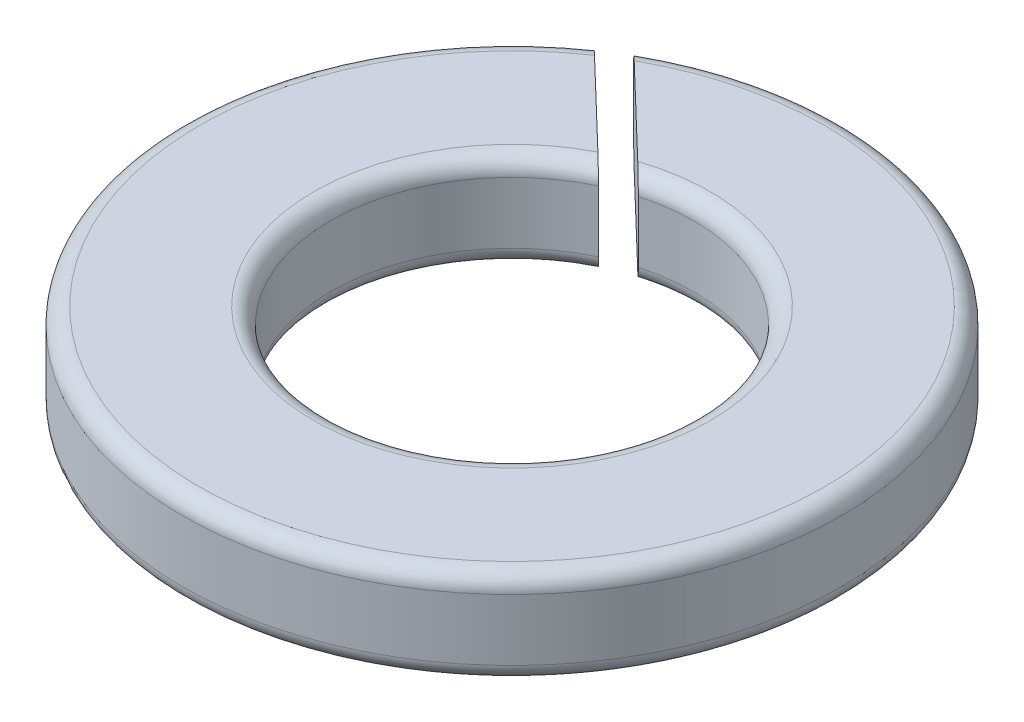
ISO-10303-21;
HEADER;
FILE_DESCRIPTION(('STEP AP214'),'2;1');
FILE_NAME('part.step','',(''),(''),'','','');
FILE_SCHEMA(('AUTOMOTIVE_DESIGN { 1 0 10303 214 1 1 1 1 }'));
ENDSEC;
DATA;
#1=APPLICATION_CONTEXT('core data for automotive mechanical design processes');
#2=APPLICATION_PROTOCOL_DEFINITION('international standard','automotive_design',2000,#1);
#3=PRODUCT_CONTEXT('',#1,'mechanical');
#4=PRODUCT('Part','Part','',(#3));
#5=PRODUCT_RELATED_PRODUCT_CATEGORY('part','',(#4));
#6=PRODUCT_DEFINITION_FORMATION('','',#4);
#7=PRODUCT_DEFINITION_CONTEXT('part definition',#1,'design');
#8=PRODUCT_DEFINITION('design','',#6,#7);
#9=PRODUCT_DEFINITION_SHAPE('','',#8);
#10=(LENGTH_UNIT() NAMED_UNIT(*) SI_UNIT(.MILLI.,.METRE.));
#11=(NAMED_UNIT(*) PLANE_ANGLE_UNIT() SI_UNIT($,.RADIAN.));
#12=(NAMED_UNIT(*) SI_UNIT($,.STERADIAN.) SOLID_ANGLE_UNIT());
#13=UNCERTAINTY_MEASURE_WITH_UNIT(LENGTH_MEASURE(1.E-05),#10,'distance_accuracy_value','');
#14=(GEOMETRIC_REPRESENTATION_CONTEXT(3) GLOBAL_UNCERTAINTY_ASSIGNED_CONTEXT((#13)) GLOBAL_UNIT_ASSIGNED_CONTEXT((#10,
#11,#12)) REPRESENTATION_CONTEXT('',''));
#15=CARTESIAN_POINT('',(0.,0.,0.));
#16=DIRECTION('',(0.,0.,1.));
#17=DIRECTION('',(1.,0.,0.));
#18=AXIS2_PLACEMENT_3D('',#15,#16,#17);
#19=CARTESIAN_POINT('',(-0.661624244853836,0.,-2.23760962036316));
#20=DIRECTION('',(-0.692531828189713,0.,0.721387321030952));
#21=DIRECTION('',(0.,1.,0.));
#22=AXIS2_PLACEMENT_3D('',#19,#20,#21);
#23=PLANE('',#22);
#24=CARTESIAN_POINT('',(-1.39063064984162,0.3,-2.93745576915144));
#25=CARTESIAN_POINT('',(-1.39063064984162,0.240064565782767,-2.93745576915144));
#26=CARTESIAN_POINT('',(-1.40954544991631,0.182080681289541,-2.95561397722314));
#27=CARTESIAN_POINT('',(-1.42744367148134,0.127213148576394,-2.97279626992557));
#28=CARTESIAN_POINT('',(-1.46075111564965,0.0847576622537913,-3.00477141632714));
#29=CARTESIAN_POINT('',(-1.49200131119978,0.0449244573085869,-3.03477160405527));
#30=CARTESIAN_POINT('',(-1.53500136012196,0.0219914936761899,-3.07605165102056));
#31=CARTESIAN_POINT('',(-1.57623612241025,0.,-3.11563702281732));
#32=CARTESIAN_POINT('',(-1.62078935238679,0.,-3.1584081235948));
#33=B_SPLINE_CURVE_WITH_KNOTS('',2,(#24,#25,#26,#27,#28,#29,#30,#31,#32),.UNSPECIFIED.,.F.,.F.,
(3,2,2,2,3),(0.,0.25,0.5,0.75,1.),.UNSPECIFIED.);
#34=CARTESIAN_POINT('',(-1.39063064984162,0.3,-2.93745576915144));
#35=VERTEX_POINT('',#34);
#36=CARTESIAN_POINT('',(-1.62078935238679,0.,-3.1584081235948));
#37=VERTEX_POINT('',#36);
#38=EDGE_CURVE('E280',#35,#37,#33,.T.);
#39=ORIENTED_EDGE('',*,*,#38,.T.);
#40=DIRECTION('',(0.721387321030952,0.,0.692531828189713));
#41=VECTOR('',#40,1.);
#42=CARTESIAN_POINT('',(-0.661624244853836,0.,-2.23760962036316));
#43=LINE('',#42,#41);
#44=CARTESIAN_POINT('',(-3.1522030132907,0.,-4.62856523806255));
#45=VERTEX_POINT('',#44);
#46=EDGE_CURVE('E109',#45,#37,#43,.T.);
#47=ORIENTED_EDGE('',*,*,#46,.F.);
#48=CARTESIAN_POINT('',(-3.1522030132907,0.,-4.62856523806255));
#49=CARTESIAN_POINT('',(-3.19474502488374,0.,-4.66940556919187));
#50=CARTESIAN_POINT('',(-3.23575724624348,0.0224543842464558,-4.70877730169722));
#51=CARTESIAN_POINT('',(-3.2757982018387,0.0443769959149166,-4.74721661906863));
#52=CARTESIAN_POINT('',(-3.30756432416192,0.0866392884122419,-4.77771209649892));
#53=CARTESIAN_POINT('',(-3.33815732282433,0.127340833431982,-4.80708137521483));
#54=CARTESIAN_POINT('',(-3.35588717423857,0.184143397668912,-4.82410203257251));
#55=CARTESIAN_POINT('',(-3.3731332273255,0.239395977931206,-4.84065824353596));
#56=CARTESIAN_POINT('',(-3.3731332273255,0.3,-4.84065824353596));
#57=B_SPLINE_CURVE_WITH_KNOTS('',2,(#48,#49,#50,#51,#52,#53,#54,#55,#56),.UNSPECIFIED.,.F.,.F.,
(3,2,2,2,3),(0.,0.25,0.5,0.75,1.),.UNSPECIFIED.);
#58=CARTESIAN_POINT('',(-3.3731332273255,0.3,-4.84065824353596));
#59=VERTEX_POINT('',#58);
#60=EDGE_CURVE('E101',#45,#59,#57,.T.);
#61=ORIENTED_EDGE('',*,*,#60,.T.);
#62=DIRECTION('',(0.,-1.,0.));
#63=VECTOR('',#62,1.);
#64=CARTESIAN_POINT('',(-3.3731332273255,1.7,-4.84065824353596));
#65=LINE('',#64,#63);
#66=CARTESIAN_POINT('',(-3.3731332273255,1.4,-4.84065824353596));
#67=VERTEX_POINT('',#66);
#68=EDGE_CURVE('E106',#67,#59,#65,.T.);
#69=ORIENTED_EDGE('',*,*,#68,.F.);
#70=CARTESIAN_POINT('',(-3.3731332273255,1.4,-4.84065824353596));
#71=CARTESIAN_POINT('',(-3.3731332273255,1.45907138365267,-4.84065824353596));
#72=CARTESIAN_POINT('',(-3.35572345637414,1.51608206949855,-4.82394486342265));
#73=CARTESIAN_POINT('',(-3.33905427945935,1.57066757846667,-4.80794245358445));
#74=CARTESIAN_POINT('',(-3.30758473624198,1.61333329828882,-4.77773169209578));
#75=CARTESIAN_POINT('',(-3.27777259490511,1.65375194881677,-4.74911203641239));
#76=CARTESIAN_POINT('',(-3.2359511480073,1.67730372911873,-4.70896344739049));
#77=CARTESIAN_POINT('',(-3.19564884918872,1.7,-4.67027324052465));
#78=CARTESIAN_POINT('',(-3.1522030132907,1.7,-4.62856523806255));
#79=B_SPLINE_CURVE_WITH_KNOTS('',2,(#70,#71,#72,#73,#74,#75,#76,#77,#78),.UNSPECIFIED.,.F.,.F.,
(3,2,2,2,3),(0.,0.25,0.5,0.75,1.),.UNSPECIFIED.);
#80=CARTESIAN_POINT('',(-3.1522030132907,1.7,-4.62856523806255));
#81=VERTEX_POINT('',#80);
#82=EDGE_CURVE('E30',#67,#81,#79,.T.);
#83=ORIENTED_EDGE('',*,*,#82,.T.);
#84=DIRECTION('',(0.721387321030952,0.,0.692531828189713));
#85=VECTOR('',#84,1.);
#86=CARTESIAN_POINT('',(-0.661624244853836,1.7,-2.23760962036316));
#87=LINE('',#86,#85);
#88=CARTESIAN_POINT('',(-1.62078935238679,1.7,-3.1584081235948));
#89=VERTEX_POINT('',#88);
#90=EDGE_CURVE('E147',#81,#89,#87,.T.);
#91=ORIENTED_EDGE('',*,*,#90,.T.);
#92=CARTESIAN_POINT('',(-1.62078935238679,1.7,-3.1584081235948));
#93=CARTESIAN_POINT('',(-1.57716105169749,1.7,-3.11652495493307));
#94=CARTESIAN_POINT('',(-1.53518063783992,1.67822640549018,-3.07622375762981));
#95=CARTESIAN_POINT('',(-1.49404459254116,1.65689075184199,-3.036733154143));
#96=CARTESIAN_POINT('',(-1.46078064462385,1.61527961826963,-3.00479976414237));
#97=CARTESIAN_POINT('',(-1.42842882163026,1.57480949634539,-2.97374201406853));
#98=CARTESIAN_POINT('',(-1.40939661889834,1.51775885596053,-2.95547109944589));
#99=CARTESIAN_POINT('',(-1.39063064984162,1.46150627357644,-2.93745576915144));
#100=CARTESIAN_POINT('',(-1.39063064984162,1.4,-2.93745576915144));
#101=B_SPLINE_CURVE_WITH_KNOTS('',2,(#92,#93,#94,#95,#96,#97,#98,#99,#100),.UNSPECIFIED.,.F.,
.F.,(3,2,2,2,3),(0.,0.25,0.5,0.75,1.),.UNSPECIFIED.);
#102=CARTESIAN_POINT('',(-1.39063064984162,1.4,-2.93745576915144));
#103=VERTEX_POINT('',#102);
#104=EDGE_CURVE('E231',#89,#103,#101,.T.);
#105=ORIENTED_EDGE('',*,*,#104,.T.);
#106=DIRECTION('',(0.,-1.,0.));
#107=VECTOR('',#106,1.);
#108=CARTESIAN_POINT('',(-1.39063064984162,1.7,-2.93745576915144));
#109=LINE('',#108,#107);
#110=EDGE_CURVE('E218',#103,#35,#109,.T.);
#111=ORIENTED_EDGE('',*,*,#110,.T.);
#112=EDGE_LOOP('',(#39,#47,#61,#69,#83,#91,#105,#111));
#113=FACE_BOUND('',#112,.T.);
#114=ADVANCED_FACE('F17',(#113),#23,.F.);
#115=CARTESIAN_POINT('',(-0.31535833075898,0.,-2.59830328087864));
#116=DIRECTION('',(0.692531828189713,0.,-0.721387321030952));
#117=DIRECTION('',(0.,-1.,0.));
#118=AXIS2_PLACEMENT_3D('',#115,#116,#117);
#119=PLANE('',#118);
#120=CARTESIAN_POINT('',(-1.11840182718332,0.,-3.369225037446));
#121=CARTESIAN_POINT('',(-1.02207562642053,0.,-3.27675188471373));
#122=CARTESIAN_POINT('',(-0.949566099323037,0.0811899848075681,-3.20714273870013));
#123=CARTESIAN_POINT('',(-0.914160414659938,0.120834251084927,-3.17315328142356));
#124=CARTESIAN_POINT('',(-0.892498798966269,0.17838426499504,-3.15235813035764));
#125=CARTESIAN_POINT('',(-0.870509067513767,0.236806008269757,-3.13124798816323));
#126=CARTESIAN_POINT('',(-0.870509067513767,0.3,-3.13124798816323));
#127=B_SPLINE_CURVE_WITH_KNOTS('',2,(#120,#121,#122,#123,#124,#125,#126),.UNSPECIFIED.,.F.,.F.,
(3,2,2,3),(0.,0.5,0.75,1.),.UNSPECIFIED.);
#128=CARTESIAN_POINT('',(-1.11840182718332,0.,-3.36922503744601));
#129=VERTEX_POINT('',#128);
#130=CARTESIAN_POINT('',(-0.870509067513767,0.3,-3.13124798816323));
#131=VERTEX_POINT('',#130);
#132=EDGE_CURVE('E43',#129,#131,#127,.T.);
#133=ORIENTED_EDGE('',*,*,#132,.T.);
#134=DIRECTION('',(0.,1.,0.));
#135=VECTOR('',#134,1.);
#136=CARTESIAN_POINT('',(-0.870509067513767,1.7,-3.13124798816323));
#137=LINE('',#136,#135);
#138=CARTESIAN_POINT('',(-0.870509067513767,1.4,-3.13124798816323));
#139=VERTEX_POINT('',#138);
#140=EDGE_CURVE('E203',#131,#139,#137,.T.);
#141=ORIENTED_EDGE('',*,*,#140,.T.);
#142=CARTESIAN_POINT('',(-0.870509067513767,1.4,-3.13124798816323));
#143=CARTESIAN_POINT('',(-0.870509067513767,1.46170918962137,-3.13124798816323));
#144=CARTESIAN_POINT('',(-0.89233751429902,1.52131581455627,-3.15220329707708));
#145=CARTESIAN_POINT('',(-0.912582501626827,1.57659850957951,-3.17163848491177));
#146=CARTESIAN_POINT('',(-0.949490292509978,1.61872434182078,-3.2070699641596));
#147=CARTESIAN_POINT('',(-1.02069849983487,1.7,-3.27542984319149));
#148=CARTESIAN_POINT('',(-1.11840182718332,1.7,-3.369225037446));
#149=B_SPLINE_CURVE_WITH_KNOTS('',2,(#142,#143,#144,#145,#146,#147,#148),.UNSPECIFIED.,.F.,.F.,
(3,2,2,3),(0.,0.25,0.5,1.),.UNSPECIFIED.);
#150=CARTESIAN_POINT('',(-1.11840182718332,1.7,-3.36922503744601));
#151=VERTEX_POINT('',#150);
#152=EDGE_CURVE('E116',#139,#151,#149,.T.);
#153=ORIENTED_EDGE('',*,*,#152,.T.);
#154=DIRECTION('',(-0.721387321030952,0.,-0.692531828189713));
#155=VECTOR('',#154,1.);
#156=CARTESIAN_POINT('',(-0.31535833075898,1.7,-2.59830328087864));
#157=LINE('',#156,#155);
#158=CARTESIAN_POINT('',(-2.71227498086937,1.7,-4.89934326498461));
#159=VERTEX_POINT('',#158);
#160=EDGE_CURVE('E226',#151,#159,#157,.T.);
#161=ORIENTED_EDGE('',*,*,#160,.T.);
#162=CARTESIAN_POINT('',(-2.71227498086937,1.7,-4.89934326498461));
#163=CARTESIAN_POINT('',(-2.75550071714376,1.7,-4.94083997180803));
#164=CARTESIAN_POINT('',(-2.79701740796751,1.67803615283568,-4.98069599499882));
#165=CARTESIAN_POINT('',(-2.83772439993252,1.65650066596765,-5.01977470728524));
#166=CARTESIAN_POINT('',(-2.8702946966077,1.61462018810353,-5.05104219209341));
#167=CARTESIAN_POINT('',(-2.90183710852547,1.57406141465182,-5.08132290753447));
#168=CARTESIAN_POINT('',(-2.92025537587238,1.51699942961768,-5.0990044441875));
#169=CARTESIAN_POINT('',(-2.93827377305559,1.46117628995734,-5.11630210548338));
#170=CARTESIAN_POINT('',(-2.93827377305559,1.4,-5.11630210548338));
#171=B_SPLINE_CURVE_WITH_KNOTS('',2,(#162,#163,#164,#165,#166,#167,#168,#169,#170),
.UNSPECIFIED.,.F.,.F.,(3,2,2,2,3),(0.,0.25,0.5,0.75,1.),.UNSPECIFIED.);
#172=CARTESIAN_POINT('',(-2.93827377305559,1.4,-5.11630210548338));
#173=VERTEX_POINT('',#172);
#174=EDGE_CURVE('E11',#159,#173,#171,.T.);
#175=ORIENTED_EDGE('',*,*,#174,.T.);
#176=DIRECTION('',(0.,1.,0.));
#177=VECTOR('',#176,1.);
#178=CARTESIAN_POINT('',(-2.93827377305559,1.7,-5.11630210548338));
#179=LINE('',#178,#177);
#180=CARTESIAN_POINT('',(-2.93827377305559,0.3,-5.11630210548338));
#181=VERTEX_POINT('',#180);
#182=EDGE_CURVE('E127',#181,#173,#179,.T.);
#183=ORIENTED_EDGE('',*,*,#182,.F.);
#184=CARTESIAN_POINT('',(-2.93827377305559,0.3,-5.11630210548338));
#185=CARTESIAN_POINT('',(-2.93827377305559,0.240386979014776,-5.11630210548338));
#186=CARTESIAN_POINT('',(-2.92010092409211,0.182817577446474,-5.09885617047844));
#187=CARTESIAN_POINT('',(-2.90278638921478,0.127967211753968,-5.08223421699621));
#188=CARTESIAN_POINT('',(-2.87033934145077,0.0854377644215593,-5.05108505114276));
#189=CARTESIAN_POINT('',(-2.8397719546049,0.0453720524835675,-5.02174035977072));
#190=CARTESIAN_POINT('',(-2.7972145458048,0.0222108700893015,-4.98088524732262));
#191=CARTESIAN_POINT('',(-2.75640328400884,0.,-4.9417064359985));
#192=CARTESIAN_POINT('',(-2.71227498086937,0.,-4.89934326498461));
#193=B_SPLINE_CURVE_WITH_KNOTS('',2,(#184,#185,#186,#187,#188,#189,#190,#191,#192),
.UNSPECIFIED.,.F.,.F.,(3,2,2,2,3),(0.,0.25,0.5,0.75,1.),.UNSPECIFIED.);
#194=CARTESIAN_POINT('',(-2.71227498086937,0.,-4.89934326498461));
#195=VERTEX_POINT('',#194);
#196=EDGE_CURVE('E115',#181,#195,#193,.T.);
#197=ORIENTED_EDGE('',*,*,#196,.T.);
#198=DIRECTION('',(-0.721387321030952,0.,-0.692531828189713));
#199=VECTOR('',#198,1.);
#200=CARTESIAN_POINT('',(-0.31535833075898,0.,-2.59830328087864));
#201=LINE('',#200,#199);
#202=EDGE_CURVE('E138',#129,#195,#201,.T.);
#203=ORIENTED_EDGE('',*,*,#202,.F.);
#204=EDGE_LOOP('',(#133,#141,#153,#161,#175,#183,#197,#203));
#205=FACE_BOUND('',#204,.T.);
#206=ADVANCED_FACE('F160',(#205),#119,.F.);
#207=CARTESIAN_POINT('',(0.,1.4,0.));
#208=DIRECTION('',(0.,1.,0.));
#209=DIRECTION('',(0.,0.,1.));
#210=AXIS2_PLACEMENT_3D('',#207,#208,#209);
#211=TOROIDAL_SURFACE('',#210,5.6,0.3);
#212=ORIENTED_EDGE('',*,*,#82,.F.);
#213=CARTESIAN_POINT('',(0.,1.4,0.));
#214=DIRECTION('',(0.,-1.,0.));
#215=DIRECTION('',(0.,0.,1.));
#216=AXIS2_PLACEMENT_3D('',#213,#214,#215);
#217=CIRCLE('',#216,5.9);
#218=EDGE_CURVE('E131',#173,#67,#217,.T.);
#219=ORIENTED_EDGE('',*,*,#218,.F.);
#220=ORIENTED_EDGE('',*,*,#174,.F.);
#221=CARTESIAN_POINT('',(0.,1.7,0.));
#222=DIRECTION('',(0.,1.,0.));
#223=DIRECTION('',(0.,0.,1.));
#224=AXIS2_PLACEMENT_3D('',#221,#222,#223);
#225=CIRCLE('',#224,5.6);
#226=EDGE_CURVE('E151',#81,#159,#225,.T.);
#227=ORIENTED_EDGE('',*,*,#226,.F.);
#228=EDGE_LOOP('',(#212,#219,#220,#227));
#229=FACE_BOUND('',#228,.T.);
#230=ADVANCED_FACE('F169',(#229),#211,.T.);
#231=CARTESIAN_POINT('',(0.,0.3,0.));
#232=DIRECTION('',(0.,1.,0.));
#233=DIRECTION('',(0.,0.,1.));
#234=AXIS2_PLACEMENT_3D('',#231,#232,#233);
#235=TOROIDAL_SURFACE('',#234,5.6,0.3);
#236=ORIENTED_EDGE('',*,*,#60,.F.);
#237=CARTESIAN_POINT('',(0.,0.,0.));
#238=DIRECTION('',(0.,-1.,0.));
#239=DIRECTION('',(0.,0.,1.));
#240=AXIS2_PLACEMENT_3D('',#237,#238,#239);
#241=CIRCLE('',#240,5.6);
#242=EDGE_CURVE('E225',#195,#45,#241,.T.);
#243=ORIENTED_EDGE('',*,*,#242,.F.);
#244=ORIENTED_EDGE('',*,*,#196,.F.);
#245=CARTESIAN_POINT('',(0.,0.3,0.));
#246=DIRECTION('',(0.,1.,0.));
#247=DIRECTION('',(0.,0.,1.));
#248=AXIS2_PLACEMENT_3D('',#245,#246,#247);
#249=CIRCLE('',#248,5.9);
#250=EDGE_CURVE('E120',#59,#181,#249,.T.);
#251=ORIENTED_EDGE('',*,*,#250,.F.);
#252=EDGE_LOOP('',(#236,#243,#244,#251));
#253=FACE_BOUND('',#252,.T.);
#254=ADVANCED_FACE('F121',(#253),#235,.T.);
#255=CARTESIAN_POINT('',(0.,1.4,0.));
#256=DIRECTION('',(0.,1.,0.));
#257=DIRECTION('',(0.,0.,1.));
#258=AXIS2_PLACEMENT_3D('',#255,#256,#257);
#259=TOROIDAL_SURFACE('',#258,3.55,0.3);
#260=ORIENTED_EDGE('',*,*,#104,.F.);
#261=CARTESIAN_POINT('',(0.,1.7,0.));
#262=DIRECTION('',(0.,-1.,0.));
#263=DIRECTION('',(0.,0.,1.));
#264=AXIS2_PLACEMENT_3D('',#261,#262,#263);
#265=CIRCLE('',#264,3.55);
#266=EDGE_CURVE('E221',#151,#89,#265,.T.);
#267=ORIENTED_EDGE('',*,*,#266,.F.);
#268=ORIENTED_EDGE('',*,*,#152,.F.);
#269=CARTESIAN_POINT('',(0.,1.4,0.));
#270=DIRECTION('',(0.,1.,0.));
#271=DIRECTION('',(0.,0.,1.));
#272=AXIS2_PLACEMENT_3D('',#269,#270,#271);
#273=CIRCLE('',#272,3.25);
#274=EDGE_CURVE('E212',#103,#139,#273,.T.);
#275=ORIENTED_EDGE('',*,*,#274,.F.);
#276=EDGE_LOOP('',(#260,#267,#268,#275));
#277=FACE_BOUND('',#276,.T.);
#278=ADVANCED_FACE('F173',(#277),#259,.T.);
#279=CARTESIAN_POINT('',(0.,0.3,0.));
#280=DIRECTION('',(0.,1.,0.));
#281=DIRECTION('',(0.,0.,1.));
#282=AXIS2_PLACEMENT_3D('',#279,#280,#281);
#283=TOROIDAL_SURFACE('',#282,3.55,0.3);
#284=ORIENTED_EDGE('',*,*,#38,.F.);
#285=CARTESIAN_POINT('',(0.,0.3,0.));
#286=DIRECTION('',(0.,-1.,0.));
#287=DIRECTION('',(0.,0.,1.));
#288=AXIS2_PLACEMENT_3D('',#285,#286,#287);
#289=CIRCLE('',#288,3.25);
#290=EDGE_CURVE('E211',#131,#35,#289,.T.);
#291=ORIENTED_EDGE('',*,*,#290,.F.);
#292=ORIENTED_EDGE('',*,*,#132,.F.);
#293=CARTESIAN_POINT('',(0.,0.,0.));
#294=DIRECTION('',(0.,1.,0.));
#295=DIRECTION('',(0.,0.,1.));
#296=AXIS2_PLACEMENT_3D('',#293,#294,#295);
#297=CIRCLE('',#296,3.55);
#298=EDGE_CURVE('E266',#37,#129,#297,.T.);
#299=ORIENTED_EDGE('',*,*,#298,.F.);
#300=EDGE_LOOP('',(#284,#291,#292,#299));
#301=FACE_BOUND('',#300,.T.);
#302=ADVANCED_FACE('F170',(#301),#283,.T.);
#303=CARTESIAN_POINT('',(0.,1.7,0.));
#304=DIRECTION('',(0.,-1.,0.));
#305=DIRECTION('',(0.,0.,-1.));
#306=AXIS2_PLACEMENT_3D('',#303,#304,#305);
#307=CYLINDRICAL_SURFACE('',#306,3.25);
#308=ORIENTED_EDGE('',*,*,#110,.F.);
#309=ORIENTED_EDGE('',*,*,#274,.T.);
#310=ORIENTED_EDGE('',*,*,#140,.F.);
#311=ORIENTED_EDGE('',*,*,#290,.T.);
#312=EDGE_LOOP('',(#308,#309,#310,#311));
#313=FACE_BOUND('',#312,.T.);
#314=ADVANCED_FACE('F297',(#313),#307,.F.);
#315=CARTESIAN_POINT('',(0.,1.7,0.));
#316=DIRECTION('',(0.,-1.,0.));
#317=DIRECTION('',(0.,0.,-1.));
#318=AXIS2_PLACEMENT_3D('',#315,#316,#317);
#319=CYLINDRICAL_SURFACE('',#318,5.9);
#320=ORIENTED_EDGE('',*,*,#218,.T.);
#321=ORIENTED_EDGE('',*,*,#68,.T.);
#322=ORIENTED_EDGE('',*,*,#250,.T.);
#323=ORIENTED_EDGE('',*,*,#182,.T.);
#324=EDGE_LOOP('',(#320,#321,#322,#323));
#325=FACE_BOUND('',#324,.T.);
#326=ADVANCED_FACE('F129',(#325),#319,.T.);
#327=CARTESIAN_POINT('',(0.,0.,0.));
#328=DIRECTION('',(0.,1.,0.));
#329=DIRECTION('',(1.,0.,0.));
#330=AXIS2_PLACEMENT_3D('',#327,#328,#329);
#331=PLANE('',#330);
#332=ORIENTED_EDGE('',*,*,#242,.T.);
#333=ORIENTED_EDGE('',*,*,#46,.T.);
#334=ORIENTED_EDGE('',*,*,#298,.T.);
#335=ORIENTED_EDGE('',*,*,#202,.T.);
#336=EDGE_LOOP('',(#332,#333,#334,#335));
#337=FACE_BOUND('',#336,.T.);
#338=ADVANCED_FACE('F658',(#337),#331,.F.);
#339=CARTESIAN_POINT('',(0.,1.7,0.));
#340=DIRECTION('',(0.,1.,0.));
#341=DIRECTION('',(1.,0.,0.));
#342=AXIS2_PLACEMENT_3D('',#339,#340,#341);
#343=PLANE('',#342);
#344=ORIENTED_EDGE('',*,*,#90,.F.);
#345=ORIENTED_EDGE('',*,*,#226,.T.);
#346=ORIENTED_EDGE('',*,*,#160,.F.);
#347=ORIENTED_EDGE('',*,*,#266,.T.);
#348=EDGE_LOOP('',(#344,#345,#346,#347));
#349=FACE_BOUND('',#348,.T.);
#350=ADVANCED_FACE('F304',(#349),#343,.T.);
#351=CLOSED_SHELL('',(#114,#206,#230,#254,#278,#302,#314,#326,#338,#350));
#352=MANIFOLD_SOLID_BREP('B1',#351);
#353=ADVANCED_BREP_SHAPE_REPRESENTATION('',(#18,#352),#14);
#354=SHAPE_DEFINITION_REPRESENTATION(#9,#353);
ENDSEC;
END-ISO-10303-21;
